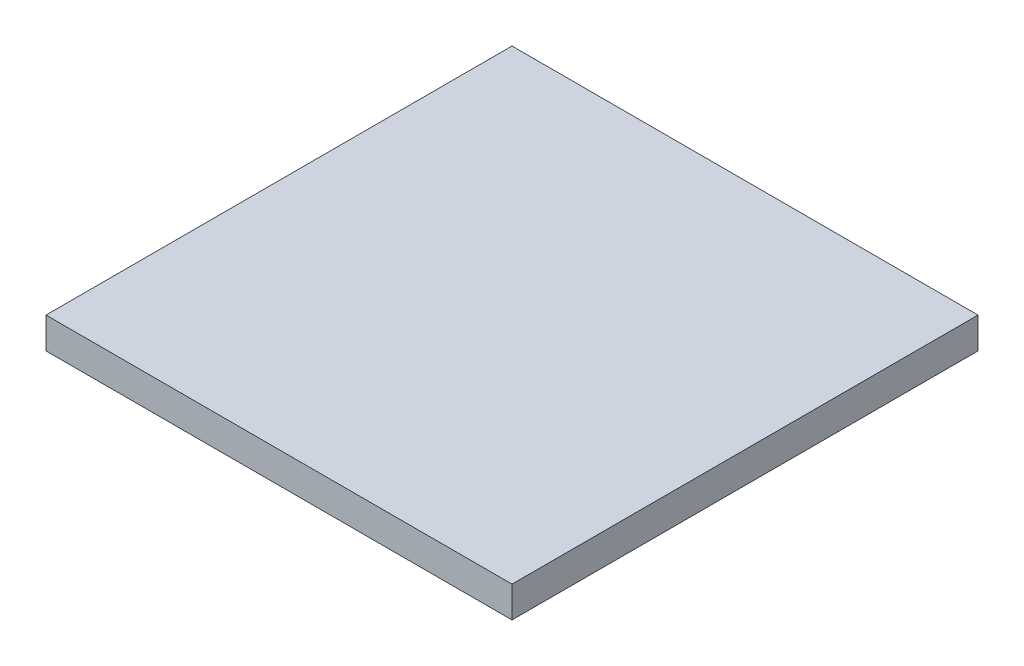
ISO-10303-21;
HEADER;
FILE_DESCRIPTION(('STEP AP214'),'2;1');
FILE_NAME('part.step','',(''),(''),'','','');
FILE_SCHEMA(('AUTOMOTIVE_DESIGN { 1 0 10303 214 1 1 1 1 }'));
ENDSEC;
DATA;
#1=APPLICATION_CONTEXT('core data for automotive mechanical design processes');
#2=APPLICATION_PROTOCOL_DEFINITION('international standard','automotive_design',2000,#1);
#3=PRODUCT_CONTEXT('',#1,'mechanical');
#4=PRODUCT('Part','Part','',(#3));
#5=PRODUCT_RELATED_PRODUCT_CATEGORY('part','',(#4));
#6=PRODUCT_DEFINITION_FORMATION('','',#4);
#7=PRODUCT_DEFINITION_CONTEXT('part definition',#1,'design');
#8=PRODUCT_DEFINITION('design','',#6,#7);
#9=PRODUCT_DEFINITION_SHAPE('','',#8);
#10=(LENGTH_UNIT() NAMED_UNIT(*) SI_UNIT(.MILLI.,.METRE.));
#11=(NAMED_UNIT(*) PLANE_ANGLE_UNIT() SI_UNIT($,.RADIAN.));
#12=(NAMED_UNIT(*) SI_UNIT($,.STERADIAN.) SOLID_ANGLE_UNIT());
#13=UNCERTAINTY_MEASURE_WITH_UNIT(LENGTH_MEASURE(1.E-05),#10,'distance_accuracy_value','');
#14=(GEOMETRIC_REPRESENTATION_CONTEXT(3) GLOBAL_UNCERTAINTY_ASSIGNED_CONTEXT((#13)) GLOBAL_UNIT_ASSIGNED_CONTEXT((#10,
#11,#12)) REPRESENTATION_CONTEXT('',''));
#15=CARTESIAN_POINT('',(0.,0.,0.));
#16=DIRECTION('',(0.,0.,1.));
#17=DIRECTION('',(1.,0.,0.));
#18=AXIS2_PLACEMENT_3D('',#15,#16,#17);
#19=CARTESIAN_POINT('',(-75.,10.,75.));
#20=DIRECTION('',(1.,0.,0.));
#21=DIRECTION('',(0.,0.,-1.));
#22=AXIS2_PLACEMENT_3D('',#19,#20,#21);
#23=PLANE('',#22);
#24=DIRECTION('',(0.,0.,1.));
#25=VECTOR('',#24,1.);
#26=CARTESIAN_POINT('',(-75.,0.,75.));
#27=LINE('',#26,#25);
#28=CARTESIAN_POINT('',(-75.,0.,-75.));
#29=VERTEX_POINT('',#28);
#30=CARTESIAN_POINT('',(-75.,0.,75.));
#31=VERTEX_POINT('',#30);
#32=EDGE_CURVE('E95',#29,#31,#27,.T.);
#33=ORIENTED_EDGE('',*,*,#32,.T.);
#34=DIRECTION('',(0.,-1.,0.));
#35=VECTOR('',#34,1.);
#36=CARTESIAN_POINT('',(-75.,10.,75.));
#37=LINE('',#36,#35);
#38=CARTESIAN_POINT('',(-75.,10.,75.));
#39=VERTEX_POINT('',#38);
#40=EDGE_CURVE('E11',#39,#31,#37,.T.);
#41=ORIENTED_EDGE('',*,*,#40,.F.);
#42=DIRECTION('',(0.,0.,1.));
#43=VECTOR('',#42,1.);
#44=CARTESIAN_POINT('',(-75.,10.,75.));
#45=LINE('',#44,#43);
#46=CARTESIAN_POINT('',(-75.,10.,-75.));
#47=VERTEX_POINT('',#46);
#48=EDGE_CURVE('E83',#47,#39,#45,.T.);
#49=ORIENTED_EDGE('',*,*,#48,.F.);
#50=DIRECTION('',(0.,-1.,0.));
#51=VECTOR('',#50,1.);
#52=CARTESIAN_POINT('',(-75.,10.,-75.));
#53=LINE('',#52,#51);
#54=EDGE_CURVE('E91',#47,#29,#53,.T.);
#55=ORIENTED_EDGE('',*,*,#54,.T.);
#56=EDGE_LOOP('',(#33,#41,#49,#55));
#57=FACE_BOUND('',#56,.T.);
#58=ADVANCED_FACE('F32',(#57),#23,.F.);
#59=CARTESIAN_POINT('',(75.,10.,75.));
#60=DIRECTION('',(0.,0.,-1.));
#61=DIRECTION('',(-1.,0.,0.));
#62=AXIS2_PLACEMENT_3D('',#59,#60,#61);
#63=PLANE('',#62);
#64=DIRECTION('',(1.,0.,0.));
#65=VECTOR('',#64,1.);
#66=CARTESIAN_POINT('',(75.,0.,75.));
#67=LINE('',#66,#65);
#68=CARTESIAN_POINT('',(75.,0.,75.));
#69=VERTEX_POINT('',#68);
#70=EDGE_CURVE('E87',#31,#69,#67,.T.);
#71=ORIENTED_EDGE('',*,*,#70,.T.);
#72=DIRECTION('',(0.,-1.,0.));
#73=VECTOR('',#72,1.);
#74=CARTESIAN_POINT('',(75.,10.,75.));
#75=LINE('',#74,#73);
#76=CARTESIAN_POINT('',(75.,10.,75.));
#77=VERTEX_POINT('',#76);
#78=EDGE_CURVE('E40',#77,#69,#75,.T.);
#79=ORIENTED_EDGE('',*,*,#78,.F.);
#80=DIRECTION('',(1.,0.,0.));
#81=VECTOR('',#80,1.);
#82=CARTESIAN_POINT('',(75.,10.,75.));
#83=LINE('',#82,#81);
#84=EDGE_CURVE('E78',#39,#77,#83,.T.);
#85=ORIENTED_EDGE('',*,*,#84,.F.);
#86=ORIENTED_EDGE('',*,*,#40,.T.);
#87=EDGE_LOOP('',(#71,#79,#85,#86));
#88=FACE_BOUND('',#87,.T.);
#89=ADVANCED_FACE('F86',(#88),#63,.F.);
#90=CARTESIAN_POINT('',(75.,10.,75.));
#91=DIRECTION('',(-1.,0.,0.));
#92=DIRECTION('',(0.,0.,1.));
#93=AXIS2_PLACEMENT_3D('',#90,#91,#92);
#94=PLANE('',#93);
#95=DIRECTION('',(0.,0.,-1.));
#96=VECTOR('',#95,1.);
#97=CARTESIAN_POINT('',(75.,0.,75.));
#98=LINE('',#97,#96);
#99=CARTESIAN_POINT('',(75.,0.,-75.));
#100=VERTEX_POINT('',#99);
#101=EDGE_CURVE('E65',#69,#100,#98,.T.);
#102=ORIENTED_EDGE('',*,*,#101,.T.);
#103=DIRECTION('',(0.,-1.,0.));
#104=VECTOR('',#103,1.);
#105=CARTESIAN_POINT('',(75.,10.,-75.));
#106=LINE('',#105,#104);
#107=CARTESIAN_POINT('',(75.,10.,-75.));
#108=VERTEX_POINT('',#107);
#109=EDGE_CURVE('E88',#108,#100,#106,.T.);
#110=ORIENTED_EDGE('',*,*,#109,.F.);
#111=DIRECTION('',(0.,0.,-1.));
#112=VECTOR('',#111,1.);
#113=CARTESIAN_POINT('',(75.,10.,75.));
#114=LINE('',#113,#112);
#115=EDGE_CURVE('E81',#77,#108,#114,.T.);
#116=ORIENTED_EDGE('',*,*,#115,.F.);
#117=ORIENTED_EDGE('',*,*,#78,.T.);
#118=EDGE_LOOP('',(#102,#110,#116,#117));
#119=FACE_BOUND('',#118,.T.);
#120=ADVANCED_FACE('F89',(#119),#94,.F.);
#121=CARTESIAN_POINT('',(75.,10.,-75.));
#122=DIRECTION('',(0.,0.,1.));
#123=DIRECTION('',(1.,0.,0.));
#124=AXIS2_PLACEMENT_3D('',#121,#122,#123);
#125=PLANE('',#124);
#126=DIRECTION('',(-1.,0.,0.));
#127=VECTOR('',#126,1.);
#128=CARTESIAN_POINT('',(75.,0.,-75.));
#129=LINE('',#128,#127);
#130=EDGE_CURVE('E71',#100,#29,#129,.T.);
#131=ORIENTED_EDGE('',*,*,#130,.T.);
#132=ORIENTED_EDGE('',*,*,#54,.F.);
#133=DIRECTION('',(-1.,0.,0.));
#134=VECTOR('',#133,1.);
#135=CARTESIAN_POINT('',(75.,10.,-75.));
#136=LINE('',#135,#134);
#137=EDGE_CURVE('E48',#108,#47,#136,.T.);
#138=ORIENTED_EDGE('',*,*,#137,.F.);
#139=ORIENTED_EDGE('',*,*,#109,.T.);
#140=EDGE_LOOP('',(#131,#132,#138,#139));
#141=FACE_BOUND('',#140,.T.);
#142=ADVANCED_FACE('F102',(#141),#125,.F.);
#143=CARTESIAN_POINT('',(0.,10.,0.));
#144=DIRECTION('',(0.,1.,0.));
#145=DIRECTION('',(0.,0.,1.));
#146=AXIS2_PLACEMENT_3D('',#143,#144,#145);
#147=PLANE('',#146);
#148=ORIENTED_EDGE('',*,*,#48,.T.);
#149=ORIENTED_EDGE('',*,*,#84,.T.);
#150=ORIENTED_EDGE('',*,*,#115,.T.);
#151=ORIENTED_EDGE('',*,*,#137,.T.);
#152=EDGE_LOOP('',(#148,#149,#150,#151));
#153=FACE_BOUND('',#152,.T.);
#154=ADVANCED_FACE('F79',(#153),#147,.T.);
#155=CARTESIAN_POINT('',(0.,0.,0.));
#156=DIRECTION('',(0.,1.,0.));
#157=DIRECTION('',(0.,0.,1.));
#158=AXIS2_PLACEMENT_3D('',#155,#156,#157);
#159=PLANE('',#158);
#160=ORIENTED_EDGE('',*,*,#32,.F.);
#161=ORIENTED_EDGE('',*,*,#130,.F.);
#162=ORIENTED_EDGE('',*,*,#101,.F.);
#163=ORIENTED_EDGE('',*,*,#70,.F.);
#164=EDGE_LOOP('',(#160,#161,#162,#163));
#165=FACE_BOUND('',#164,.T.);
#166=ADVANCED_FACE('F105',(#165),#159,.F.);
#167=CLOSED_SHELL('',(#58,#89,#120,#142,#154,#166));
#168=MANIFOLD_SOLID_BREP('B2',#167);
#169=ADVANCED_BREP_SHAPE_REPRESENTATION('',(#18,#168),#14);
#170=SHAPE_DEFINITION_REPRESENTATION(#9,#169);
ENDSEC;
END-ISO-10303-21;
